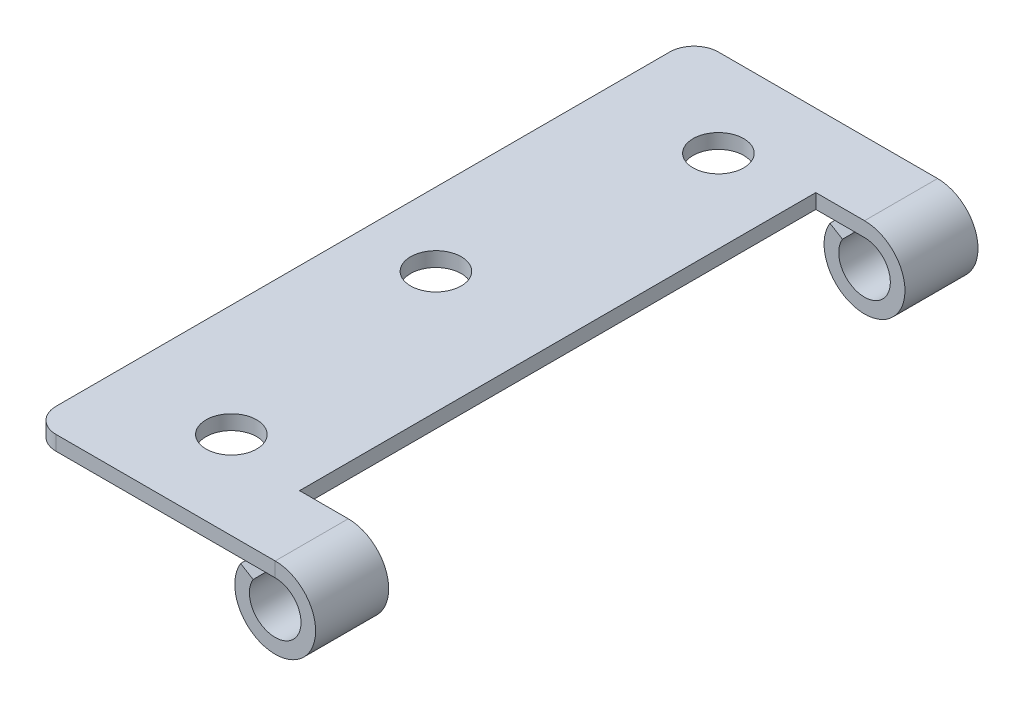
ISO-10303-21;
HEADER;
FILE_DESCRIPTION(('STEP AP214'),'2;1');
FILE_NAME('part.step','',(''),(''),'','','');
FILE_SCHEMA(('AUTOMOTIVE_DESIGN { 1 0 10303 214 1 1 1 1 }'));
ENDSEC;
DATA;
#1=APPLICATION_CONTEXT('core data for automotive mechanical design processes');
#2=APPLICATION_PROTOCOL_DEFINITION('international standard','automotive_design',2000,#1);
#3=PRODUCT_CONTEXT('',#1,'mechanical');
#4=PRODUCT('Part','Part','',(#3));
#5=PRODUCT_RELATED_PRODUCT_CATEGORY('part','',(#4));
#6=PRODUCT_DEFINITION_FORMATION('','',#4);
#7=PRODUCT_DEFINITION_CONTEXT('part definition',#1,'design');
#8=PRODUCT_DEFINITION('design','',#6,#7);
#9=PRODUCT_DEFINITION_SHAPE('','',#8);
#10=(LENGTH_UNIT() NAMED_UNIT(*) SI_UNIT(.MILLI.,.METRE.));
#11=(NAMED_UNIT(*) PLANE_ANGLE_UNIT() SI_UNIT($,.RADIAN.));
#12=(NAMED_UNIT(*) SI_UNIT($,.STERADIAN.) SOLID_ANGLE_UNIT());
#13=UNCERTAINTY_MEASURE_WITH_UNIT(LENGTH_MEASURE(1.E-05),#10,'distance_accuracy_value','');
#14=(GEOMETRIC_REPRESENTATION_CONTEXT(3) GLOBAL_UNCERTAINTY_ASSIGNED_CONTEXT((#13)) GLOBAL_UNIT_ASSIGNED_CONTEXT((#10,
#11,#12)) REPRESENTATION_CONTEXT('',''));
#15=CARTESIAN_POINT('',(0.,0.,0.));
#16=DIRECTION('',(0.,0.,1.));
#17=DIRECTION('',(1.,0.,0.));
#18=AXIS2_PLACEMENT_3D('',#15,#16,#17);
#19=CARTESIAN_POINT('',(12.5,-4.15,34.));
#20=DIRECTION('',(0.,0.,-1.));
#21=DIRECTION('',(-1.,0.,0.));
#22=AXIS2_PLACEMENT_3D('',#19,#20,#21);
#23=CYLINDRICAL_SURFACE('',#22,2.65);
#24=DIRECTION('',(0.,0.,-1.));
#25=VECTOR('',#24,1.);
#26=CARTESIAN_POINT('',(12.5,-1.5,34.));
#27=LINE('',#26,#25);
#28=CARTESIAN_POINT('',(12.5,-1.5,34.));
#29=VERTEX_POINT('',#28);
#30=CARTESIAN_POINT('',(12.5,-1.5,26.5));
#31=VERTEX_POINT('',#30);
#32=EDGE_CURVE('E212',#29,#31,#27,.T.);
#33=ORIENTED_EDGE('',*,*,#32,.T.);
#34=CARTESIAN_POINT('',(12.5,-4.15,26.5));
#35=DIRECTION('',(0.,0.,1.));
#36=DIRECTION('',(1.,0.,0.));
#37=AXIS2_PLACEMENT_3D('',#34,#35,#36);
#38=CIRCLE('',#37,2.65);
#39=CARTESIAN_POINT('',(10.2333573843064,-2.77710843373494,26.5));
#40=VERTEX_POINT('',#39);
#41=EDGE_CURVE('E179',#31,#40,#38,.F.);
#42=ORIENTED_EDGE('',*,*,#41,.T.);
#43=DIRECTION('',(0.,0.,-1.));
#44=VECTOR('',#43,1.);
#45=CARTESIAN_POINT('',(10.2333573843064,-2.77710843373494,34.));
#46=LINE('',#45,#44);
#47=CARTESIAN_POINT('',(10.2333573843064,-2.77710843373494,34.));
#48=VERTEX_POINT('',#47);
#49=EDGE_CURVE('E227',#48,#40,#46,.T.);
#50=ORIENTED_EDGE('',*,*,#49,.F.);
#51=CARTESIAN_POINT('',(12.5,-4.15,34.));
#52=DIRECTION('',(0.,0.,1.));
#53=DIRECTION('',(1.,0.,0.));
#54=AXIS2_PLACEMENT_3D('',#51,#52,#53);
#55=CIRCLE('',#54,2.65);
#56=EDGE_CURVE('E187',#29,#48,#55,.F.);
#57=ORIENTED_EDGE('',*,*,#56,.F.);
#58=EDGE_LOOP('',(#33,#42,#50,#57));
#59=FACE_BOUND('',#58,.T.);
#60=ADVANCED_FACE('F39',(#59),#23,.F.);
#61=CARTESIAN_POINT('',(8.95035213014023,-2.,34.));
#62=DIRECTION('',(0.518072289156626,0.855336836110788,0.));
#63=DIRECTION('',(-0.855336836110788,0.518072289156627,0.));
#64=AXIS2_PLACEMENT_3D('',#61,#62,#63);
#65=PLANE('',#64);
#66=DIRECTION('',(0.855336836110788,-0.518072289156627,0.));
#67=VECTOR('',#66,1.);
#68=CARTESIAN_POINT('',(8.95035213014023,-2.,26.5));
#69=LINE('',#68,#67);
#70=CARTESIAN_POINT('',(8.95035213014023,-2.,26.5));
#71=VERTEX_POINT('',#70);
#72=EDGE_CURVE('E182',#71,#40,#69,.T.);
#73=ORIENTED_EDGE('',*,*,#72,.F.);
#74=DIRECTION('',(0.,0.,-1.));
#75=VECTOR('',#74,1.);
#76=CARTESIAN_POINT('',(8.95035213014023,-2.,34.));
#77=LINE('',#76,#75);
#78=CARTESIAN_POINT('',(8.95035213014023,-2.,34.));
#79=VERTEX_POINT('',#78);
#80=EDGE_CURVE('E223',#79,#71,#77,.T.);
#81=ORIENTED_EDGE('',*,*,#80,.F.);
#82=DIRECTION('',(0.855336836110788,-0.518072289156627,0.));
#83=VECTOR('',#82,1.);
#84=CARTESIAN_POINT('',(8.95035213014023,-2.,34.));
#85=LINE('',#84,#83);
#86=EDGE_CURVE('E189',#79,#48,#85,.T.);
#87=ORIENTED_EDGE('',*,*,#86,.T.);
#88=ORIENTED_EDGE('',*,*,#49,.T.);
#89=EDGE_LOOP('',(#73,#81,#87,#88));
#90=FACE_BOUND('',#89,.T.);
#91=ADVANCED_FACE('F297',(#90),#65,.T.);
#92=CARTESIAN_POINT('',(12.5,-4.15,34.));
#93=DIRECTION('',(0.,0.,-1.));
#94=DIRECTION('',(-1.,0.,0.));
#95=AXIS2_PLACEMENT_3D('',#92,#93,#94);
#96=CYLINDRICAL_SURFACE('',#95,4.15);
#97=ORIENTED_EDGE('',*,*,#80,.T.);
#98=CARTESIAN_POINT('',(12.5,-4.15,26.5));
#99=DIRECTION('',(0.,0.,1.));
#100=DIRECTION('',(1.,0.,0.));
#101=AXIS2_PLACEMENT_3D('',#98,#99,#100);
#102=CIRCLE('',#101,4.15);
#103=CARTESIAN_POINT('',(12.5,0.,26.5));
#104=VERTEX_POINT('',#103);
#105=EDGE_CURVE('E184',#104,#71,#102,.F.);
#106=ORIENTED_EDGE('',*,*,#105,.F.);
#107=DIRECTION('',(0.,0.,-1.));
#108=VECTOR('',#107,1.);
#109=CARTESIAN_POINT('',(12.5,0.,34.));
#110=LINE('',#109,#108);
#111=CARTESIAN_POINT('',(12.5,0.,34.));
#112=VERTEX_POINT('',#111);
#113=EDGE_CURVE('E220',#112,#104,#110,.T.);
#114=ORIENTED_EDGE('',*,*,#113,.F.);
#115=CARTESIAN_POINT('',(12.5,-4.15,34.));
#116=DIRECTION('',(0.,0.,-1.));
#117=DIRECTION('',(-1.,0.,0.));
#118=AXIS2_PLACEMENT_3D('',#115,#116,#117);
#119=CIRCLE('',#118,4.15);
#120=EDGE_CURVE('E193',#112,#79,#119,.T.);
#121=ORIENTED_EDGE('',*,*,#120,.T.);
#122=EDGE_LOOP('',(#97,#106,#114,#121));
#123=FACE_BOUND('',#122,.T.);
#124=ADVANCED_FACE('F290',(#123),#96,.T.);
#125=CARTESIAN_POINT('',(12.5,-1.5,34.));
#126=DIRECTION('',(0.,0.,1.));
#127=DIRECTION('',(1.,0.,0.));
#128=AXIS2_PLACEMENT_3D('',#125,#126,#127);
#129=PLANE('',#128);
#130=DIRECTION('',(0.,1.,0.));
#131=VECTOR('',#130,1.);
#132=CARTESIAN_POINT('',(12.5,-1.5,34.));
#133=LINE('',#132,#131);
#134=EDGE_CURVE('E233',#29,#112,#133,.T.);
#135=ORIENTED_EDGE('',*,*,#134,.F.);
#136=ORIENTED_EDGE('',*,*,#56,.T.);
#137=ORIENTED_EDGE('',*,*,#86,.F.);
#138=ORIENTED_EDGE('',*,*,#120,.F.);
#139=EDGE_LOOP('',(#135,#136,#137,#138));
#140=FACE_BOUND('',#139,.T.);
#141=ADVANCED_FACE('F292',(#140),#129,.T.);
#142=CARTESIAN_POINT('',(12.5,0.,-34.));
#143=DIRECTION('',(0.,0.,-1.));
#144=DIRECTION('',(-1.,0.,0.));
#145=AXIS2_PLACEMENT_3D('',#142,#143,#144);
#146=PLANE('',#145);
#147=DIRECTION('',(0.,-1.,0.));
#148=VECTOR('',#147,1.);
#149=CARTESIAN_POINT('',(12.5,0.,-34.));
#150=LINE('',#149,#148);
#151=CARTESIAN_POINT('',(12.5,0.,-34.));
#152=VERTEX_POINT('',#151);
#153=CARTESIAN_POINT('',(12.5,-1.5,-34.));
#154=VERTEX_POINT('',#153);
#155=EDGE_CURVE('E230',#152,#154,#150,.T.);
#156=ORIENTED_EDGE('',*,*,#155,.F.);
#157=CARTESIAN_POINT('',(12.5,-4.15,-34.));
#158=DIRECTION('',(0.,0.,-1.));
#159=DIRECTION('',(-1.,0.,0.));
#160=AXIS2_PLACEMENT_3D('',#157,#158,#159);
#161=CIRCLE('',#160,4.15);
#162=CARTESIAN_POINT('',(8.95035213014023,-2.,-34.));
#163=VERTEX_POINT('',#162);
#164=EDGE_CURVE('E206',#152,#163,#161,.T.);
#165=ORIENTED_EDGE('',*,*,#164,.T.);
#166=DIRECTION('',(0.855336836110788,-0.518072289156627,0.));
#167=VECTOR('',#166,1.);
#168=CARTESIAN_POINT('',(8.95035213014023,-2.,-34.));
#169=LINE('',#168,#167);
#170=CARTESIAN_POINT('',(10.2333573843064,-2.77710843373494,-34.));
#171=VERTEX_POINT('',#170);
#172=EDGE_CURVE('E203',#163,#171,#169,.T.);
#173=ORIENTED_EDGE('',*,*,#172,.T.);
#174=CARTESIAN_POINT('',(12.5,-4.15,-34.));
#175=DIRECTION('',(0.,0.,1.));
#176=DIRECTION('',(1.,0.,0.));
#177=AXIS2_PLACEMENT_3D('',#174,#175,#176);
#178=CIRCLE('',#177,2.65);
#179=EDGE_CURVE('E186',#154,#171,#178,.F.);
#180=ORIENTED_EDGE('',*,*,#179,.F.);
#181=EDGE_LOOP('',(#156,#165,#173,#180));
#182=FACE_BOUND('',#181,.T.);
#183=ADVANCED_FACE('F313',(#182),#146,.T.);
#184=CARTESIAN_POINT('',(10.2333573843064,-2.77710843373494,-26.5));
#185=VERTEX_POINT('',#184);
#186=EDGE_CURVE('E226',#185,#171,#46,.T.);
#187=ORIENTED_EDGE('',*,*,#186,.F.);
#188=CARTESIAN_POINT('',(12.5,-4.15,-26.5));
#189=DIRECTION('',(0.,0.,-1.));
#190=DIRECTION('',(-1.,0.,0.));
#191=AXIS2_PLACEMENT_3D('',#188,#189,#190);
#192=CIRCLE('',#191,2.65);
#193=CARTESIAN_POINT('',(12.5,-1.5,-26.5));
#194=VERTEX_POINT('',#193);
#195=EDGE_CURVE('E172',#185,#194,#192,.F.);
#196=ORIENTED_EDGE('',*,*,#195,.T.);
#197=EDGE_CURVE('E200',#194,#154,#27,.T.);
#198=ORIENTED_EDGE('',*,*,#197,.T.);
#199=ORIENTED_EDGE('',*,*,#179,.T.);
#200=EDGE_LOOP('',(#187,#196,#198,#199));
#201=FACE_BOUND('',#200,.T.);
#202=ADVANCED_FACE('F304',(#201),#23,.F.);
#203=DIRECTION('',(-0.855336836110788,0.518072289156627,0.));
#204=VECTOR('',#203,1.);
#205=CARTESIAN_POINT('',(8.9503521301402,-1.99999999999998,-26.5));
#206=LINE('',#205,#204);
#207=CARTESIAN_POINT('',(8.95035213014023,-2.,-26.5));
#208=VERTEX_POINT('',#207);
#209=EDGE_CURVE('E176',#185,#208,#206,.T.);
#210=ORIENTED_EDGE('',*,*,#209,.F.);
#211=ORIENTED_EDGE('',*,*,#186,.T.);
#212=ORIENTED_EDGE('',*,*,#172,.F.);
#213=EDGE_CURVE('E222',#208,#163,#77,.T.);
#214=ORIENTED_EDGE('',*,*,#213,.F.);
#215=EDGE_LOOP('',(#210,#211,#212,#214));
#216=FACE_BOUND('',#215,.T.);
#217=ADVANCED_FACE('F307',(#216),#65,.T.);
#218=CARTESIAN_POINT('',(12.5,-4.15,-26.5));
#219=DIRECTION('',(0.,0.,-1.));
#220=DIRECTION('',(-1.,0.,0.));
#221=AXIS2_PLACEMENT_3D('',#218,#219,#220);
#222=CIRCLE('',#221,4.15);
#223=CARTESIAN_POINT('',(12.5,0.,-26.5));
#224=VERTEX_POINT('',#223);
#225=EDGE_CURVE('E159',#208,#224,#222,.F.);
#226=ORIENTED_EDGE('',*,*,#225,.F.);
#227=ORIENTED_EDGE('',*,*,#213,.T.);
#228=ORIENTED_EDGE('',*,*,#164,.F.);
#229=EDGE_CURVE('E219',#224,#152,#110,.T.);
#230=ORIENTED_EDGE('',*,*,#229,.F.);
#231=EDGE_LOOP('',(#226,#227,#228,#230));
#232=FACE_BOUND('',#231,.T.);
#233=ADVANCED_FACE('F311',(#232),#96,.T.);
#234=CARTESIAN_POINT('',(-12.5,0.,34.));
#235=DIRECTION('',(0.,1.,0.));
#236=DIRECTION('',(-1.,0.,0.));
#237=AXIS2_PLACEMENT_3D('',#234,#235,#236);
#238=PLANE('',#237);
#239=CARTESIAN_POINT('',(-0.999999999999995,0.,25.));
#240=DIRECTION('',(0.,1.,0.));
#241=DIRECTION('',(-1.,0.,0.));
#242=AXIS2_PLACEMENT_3D('',#239,#240,#241);
#243=CIRCLE('',#242,2.6);
#244=CARTESIAN_POINT('',(-3.6,0.,25.));
#245=VERTEX_POINT('',#244);
#246=EDGE_CURVE('E250',#245,#245,#243,.T.);
#247=ORIENTED_EDGE('',*,*,#246,.F.);
#248=EDGE_LOOP('',(#247));
#249=FACE_BOUND('',#248,.T.);
#250=CARTESIAN_POINT('',(-5.,0.,0.));
#251=DIRECTION('',(0.,1.,0.));
#252=DIRECTION('',(-1.,0.,0.));
#253=AXIS2_PLACEMENT_3D('',#250,#251,#252);
#254=CIRCLE('',#253,2.6);
#255=CARTESIAN_POINT('',(-7.6,0.,0.));
#256=VERTEX_POINT('',#255);
#257=EDGE_CURVE('E373',#256,#256,#254,.T.);
#258=ORIENTED_EDGE('',*,*,#257,.F.);
#259=EDGE_LOOP('',(#258));
#260=FACE_BOUND('',#259,.T.);
#261=CARTESIAN_POINT('',(-1.,0.,-25.));
#262=DIRECTION('',(0.,1.,0.));
#263=DIRECTION('',(-1.,0.,0.));
#264=AXIS2_PLACEMENT_3D('',#261,#262,#263);
#265=CIRCLE('',#264,2.6);
#266=CARTESIAN_POINT('',(-3.6,0.,-25.));
#267=VERTEX_POINT('',#266);
#268=EDGE_CURVE('E245',#267,#267,#265,.T.);
#269=ORIENTED_EDGE('',*,*,#268,.F.);
#270=EDGE_LOOP('',(#269));
#271=FACE_BOUND('',#270,.T.);
#272=DIRECTION('',(1.,0.,0.));
#273=VECTOR('',#272,1.);
#274=CARTESIAN_POINT('',(-12.5,0.,-34.));
#275=LINE('',#274,#273);
#276=CARTESIAN_POINT('',(-10.,0.,-34.));
#277=VERTEX_POINT('',#276);
#278=EDGE_CURVE('E209',#277,#152,#275,.T.);
#279=ORIENTED_EDGE('',*,*,#278,.F.);
#280=CARTESIAN_POINT('',(-10.,0.,-31.5));
#281=DIRECTION('',(0.,1.,0.));
#282=DIRECTION('',(-1.,0.,0.));
#283=AXIS2_PLACEMENT_3D('',#280,#281,#282);
#284=CIRCLE('',#283,2.5);
#285=CARTESIAN_POINT('',(-12.5,0.,-31.5));
#286=VERTEX_POINT('',#285);
#287=EDGE_CURVE('E257',#277,#286,#284,.T.);
#288=ORIENTED_EDGE('',*,*,#287,.T.);
#289=DIRECTION('',(0.,0.,-1.));
#290=VECTOR('',#289,1.);
#291=CARTESIAN_POINT('',(-12.5,0.,34.));
#292=LINE('',#291,#290);
#293=CARTESIAN_POINT('',(-12.5,0.,31.5));
#294=VERTEX_POINT('',#293);
#295=EDGE_CURVE('E217',#294,#286,#292,.T.);
#296=ORIENTED_EDGE('',*,*,#295,.F.);
#297=CARTESIAN_POINT('',(-10.,0.,31.5));
#298=DIRECTION('',(0.,1.,0.));
#299=DIRECTION('',(-1.,0.,0.));
#300=AXIS2_PLACEMENT_3D('',#297,#298,#299);
#301=CIRCLE('',#300,2.5);
#302=CARTESIAN_POINT('',(-10.,0.,34.));
#303=VERTEX_POINT('',#302);
#304=EDGE_CURVE('E255',#294,#303,#301,.T.);
#305=ORIENTED_EDGE('',*,*,#304,.T.);
#306=DIRECTION('',(1.,0.,0.));
#307=VECTOR('',#306,1.);
#308=CARTESIAN_POINT('',(-12.5,0.,34.));
#309=LINE('',#308,#307);
#310=EDGE_CURVE('E196',#303,#112,#309,.T.);
#311=ORIENTED_EDGE('',*,*,#310,.T.);
#312=ORIENTED_EDGE('',*,*,#113,.T.);
#313=DIRECTION('',(1.,0.,0.));
#314=VECTOR('',#313,1.);
#315=CARTESIAN_POINT('',(16.65,0.,26.5));
#316=LINE('',#315,#314);
#317=CARTESIAN_POINT('',(7.5,0.,26.5));
#318=VERTEX_POINT('',#317);
#319=EDGE_CURVE('E153',#318,#104,#316,.T.);
#320=ORIENTED_EDGE('',*,*,#319,.F.);
#321=DIRECTION('',(0.,0.,1.));
#322=VECTOR('',#321,1.);
#323=CARTESIAN_POINT('',(7.5,0.,-26.5));
#324=LINE('',#323,#322);
#325=CARTESIAN_POINT('',(7.5,0.,-26.5));
#326=VERTEX_POINT('',#325);
#327=EDGE_CURVE('E146',#326,#318,#324,.T.);
#328=ORIENTED_EDGE('',*,*,#327,.F.);
#329=DIRECTION('',(-1.,0.,0.));
#330=VECTOR('',#329,1.);
#331=CARTESIAN_POINT('',(16.65,0.,-26.5));
#332=LINE('',#331,#330);
#333=EDGE_CURVE('E156',#224,#326,#332,.T.);
#334=ORIENTED_EDGE('',*,*,#333,.F.);
#335=ORIENTED_EDGE('',*,*,#229,.T.);
#336=EDGE_LOOP('',(#279,#288,#296,#305,#311,#312,#320,#328,#334,#335));
#337=FACE_BOUND('',#336,.T.);
#338=ADVANCED_FACE('F166',(#249,#260,#271,#337),#238,.T.);
#339=CARTESIAN_POINT('',(-12.5,-1.5,34.));
#340=DIRECTION('',(-1.,0.,0.));
#341=DIRECTION('',(0.,0.,1.));
#342=AXIS2_PLACEMENT_3D('',#339,#340,#341);
#343=PLANE('',#342);
#344=ORIENTED_EDGE('',*,*,#295,.T.);
#345=DIRECTION('',(0.,1.,0.));
#346=VECTOR('',#345,1.);
#347=CARTESIAN_POINT('',(-12.5,-1.5,-31.5));
#348=LINE('',#347,#346);
#349=CARTESIAN_POINT('',(-12.5,-1.5,-31.5));
#350=VERTEX_POINT('',#349);
#351=EDGE_CURVE('E60',#286,#350,#348,.F.);
#352=ORIENTED_EDGE('',*,*,#351,.T.);
#353=DIRECTION('',(0.,0.,-1.));
#354=VECTOR('',#353,1.);
#355=CARTESIAN_POINT('',(-12.5,-1.5,34.));
#356=LINE('',#355,#354);
#357=CARTESIAN_POINT('',(-12.5,-1.5,31.5));
#358=VERTEX_POINT('',#357);
#359=EDGE_CURVE('E215',#358,#350,#356,.T.);
#360=ORIENTED_EDGE('',*,*,#359,.F.);
#361=DIRECTION('',(0.,1.,0.));
#362=VECTOR('',#361,1.);
#363=CARTESIAN_POINT('',(-12.5,-1.5,31.5));
#364=LINE('',#363,#362);
#365=EDGE_CURVE('E259',#358,#294,#364,.T.);
#366=ORIENTED_EDGE('',*,*,#365,.T.);
#367=EDGE_LOOP('',(#344,#352,#360,#366));
#368=FACE_BOUND('',#367,.T.);
#369=ADVANCED_FACE('F278',(#368),#343,.T.);
#370=CARTESIAN_POINT('',(-12.5,-1.5,34.));
#371=DIRECTION('',(0.,1.,0.));
#372=DIRECTION('',(-1.,0.,0.));
#373=AXIS2_PLACEMENT_3D('',#370,#371,#372);
#374=PLANE('',#373);
#375=CARTESIAN_POINT('',(-0.999999999999995,-1.5,25.));
#376=DIRECTION('',(0.,1.,0.));
#377=DIRECTION('',(-1.,0.,0.));
#378=AXIS2_PLACEMENT_3D('',#375,#376,#377);
#379=CIRCLE('',#378,2.6);
#380=CARTESIAN_POINT('',(-3.6,-1.5,25.));
#381=VERTEX_POINT('',#380);
#382=EDGE_CURVE('E249',#381,#381,#379,.T.);
#383=ORIENTED_EDGE('',*,*,#382,.T.);
#384=EDGE_LOOP('',(#383));
#385=FACE_BOUND('',#384,.T.);
#386=CARTESIAN_POINT('',(-5.,-1.5,0.));
#387=DIRECTION('',(0.,1.,0.));
#388=DIRECTION('',(-1.,0.,0.));
#389=AXIS2_PLACEMENT_3D('',#386,#387,#388);
#390=CIRCLE('',#389,2.6);
#391=CARTESIAN_POINT('',(-7.6,-1.5,0.));
#392=VERTEX_POINT('',#391);
#393=EDGE_CURVE('E246',#392,#392,#390,.T.);
#394=ORIENTED_EDGE('',*,*,#393,.T.);
#395=EDGE_LOOP('',(#394));
#396=FACE_BOUND('',#395,.T.);
#397=CARTESIAN_POINT('',(-1.,-1.5,-25.));
#398=DIRECTION('',(0.,1.,0.));
#399=DIRECTION('',(-1.,0.,0.));
#400=AXIS2_PLACEMENT_3D('',#397,#398,#399);
#401=CIRCLE('',#400,2.6);
#402=CARTESIAN_POINT('',(-3.6,-1.5,-25.));
#403=VERTEX_POINT('',#402);
#404=EDGE_CURVE('E163',#403,#403,#401,.T.);
#405=ORIENTED_EDGE('',*,*,#404,.T.);
#406=EDGE_LOOP('',(#405));
#407=FACE_BOUND('',#406,.T.);
#408=ORIENTED_EDGE('',*,*,#359,.T.);
#409=CARTESIAN_POINT('',(-10.,-1.5,-31.5));
#410=DIRECTION('',(0.,1.,0.));
#411=DIRECTION('',(-1.,0.,0.));
#412=AXIS2_PLACEMENT_3D('',#409,#410,#411);
#413=CIRCLE('',#412,2.5);
#414=CARTESIAN_POINT('',(-10.,-1.5,-34.));
#415=VERTEX_POINT('',#414);
#416=EDGE_CURVE('E47',#350,#415,#413,.F.);
#417=ORIENTED_EDGE('',*,*,#416,.T.);
#418=DIRECTION('',(1.,0.,0.));
#419=VECTOR('',#418,1.);
#420=CARTESIAN_POINT('',(-12.5,-1.5,-34.));
#421=LINE('',#420,#419);
#422=EDGE_CURVE('E190',#415,#154,#421,.T.);
#423=ORIENTED_EDGE('',*,*,#422,.T.);
#424=ORIENTED_EDGE('',*,*,#197,.F.);
#425=DIRECTION('',(-1.,0.,0.));
#426=VECTOR('',#425,1.);
#427=CARTESIAN_POINT('',(-12.5,-1.5,-26.5));
#428=LINE('',#427,#426);
#429=CARTESIAN_POINT('',(7.5,-1.5,-26.5));
#430=VERTEX_POINT('',#429);
#431=EDGE_CURVE('E236',#194,#430,#428,.T.);
#432=ORIENTED_EDGE('',*,*,#431,.T.);
#433=DIRECTION('',(0.,0.,1.));
#434=VECTOR('',#433,1.);
#435=CARTESIAN_POINT('',(7.5,-1.5,34.));
#436=LINE('',#435,#434);
#437=CARTESIAN_POINT('',(7.5,-1.5,26.5));
#438=VERTEX_POINT('',#437);
#439=EDGE_CURVE('E149',#430,#438,#436,.T.);
#440=ORIENTED_EDGE('',*,*,#439,.T.);
#441=DIRECTION('',(1.,0.,0.));
#442=VECTOR('',#441,1.);
#443=CARTESIAN_POINT('',(-12.5,-1.5,26.5));
#444=LINE('',#443,#442);
#445=EDGE_CURVE('E239',#438,#31,#444,.T.);
#446=ORIENTED_EDGE('',*,*,#445,.T.);
#447=ORIENTED_EDGE('',*,*,#32,.F.);
#448=DIRECTION('',(1.,0.,0.));
#449=VECTOR('',#448,1.);
#450=CARTESIAN_POINT('',(-12.5,-1.5,34.));
#451=LINE('',#450,#449);
#452=CARTESIAN_POINT('',(-10.,-1.5,34.));
#453=VERTEX_POINT('',#452);
#454=EDGE_CURVE('E198',#453,#29,#451,.T.);
#455=ORIENTED_EDGE('',*,*,#454,.F.);
#456=CARTESIAN_POINT('',(-10.,-1.5,31.5));
#457=DIRECTION('',(0.,1.,0.));
#458=DIRECTION('',(-1.,0.,0.));
#459=AXIS2_PLACEMENT_3D('',#456,#457,#458);
#460=CIRCLE('',#459,2.5);
#461=EDGE_CURVE('E263',#453,#358,#460,.F.);
#462=ORIENTED_EDGE('',*,*,#461,.T.);
#463=EDGE_LOOP('',(#408,#417,#423,#424,#432,#440,#446,#447,#455,#462));
#464=FACE_BOUND('',#463,.T.);
#465=ADVANCED_FACE('F267',(#385,#396,#407,#464),#374,.F.);
#466=CARTESIAN_POINT('',(12.5,-4.15,34.));
#467=DIRECTION('',(0.,0.,1.));
#468=DIRECTION('',(1.,0.,0.));
#469=AXIS2_PLACEMENT_3D('',#466,#467,#468);
#470=PLANE('',#469);
#471=ORIENTED_EDGE('',*,*,#310,.F.);
#472=DIRECTION('',(0.,1.,0.));
#473=VECTOR('',#472,1.);
#474=CARTESIAN_POINT('',(-10.,-4.15,34.));
#475=LINE('',#474,#473);
#476=EDGE_CURVE('E11',#303,#453,#475,.F.);
#477=ORIENTED_EDGE('',*,*,#476,.T.);
#478=ORIENTED_EDGE('',*,*,#454,.T.);
#479=ORIENTED_EDGE('',*,*,#134,.T.);
#480=EDGE_LOOP('',(#471,#477,#478,#479));
#481=FACE_BOUND('',#480,.T.);
#482=ADVANCED_FACE('F282',(#481),#470,.T.);
#483=CARTESIAN_POINT('',(12.5,-4.15,-34.));
#484=DIRECTION('',(0.,0.,1.));
#485=DIRECTION('',(1.,0.,0.));
#486=AXIS2_PLACEMENT_3D('',#483,#484,#485);
#487=PLANE('',#486);
#488=ORIENTED_EDGE('',*,*,#422,.F.);
#489=DIRECTION('',(0.,1.,0.));
#490=VECTOR('',#489,1.);
#491=CARTESIAN_POINT('',(-10.,0.,-34.));
#492=LINE('',#491,#490);
#493=EDGE_CURVE('E242',#415,#277,#492,.T.);
#494=ORIENTED_EDGE('',*,*,#493,.T.);
#495=ORIENTED_EDGE('',*,*,#278,.T.);
#496=ORIENTED_EDGE('',*,*,#155,.T.);
#497=EDGE_LOOP('',(#488,#494,#495,#496));
#498=FACE_BOUND('',#497,.T.);
#499=ADVANCED_FACE('F273',(#498),#487,.F.);
#500=CARTESIAN_POINT('',(7.5,-8.3,-26.5));
#501=DIRECTION('',(-1.,0.,0.));
#502=DIRECTION('',(0.,0.,1.));
#503=AXIS2_PLACEMENT_3D('',#500,#501,#502);
#504=PLANE('',#503);
#505=DIRECTION('',(0.,1.,0.));
#506=VECTOR('',#505,1.);
#507=CARTESIAN_POINT('',(7.5,-8.3,-26.5));
#508=LINE('',#507,#506);
#509=EDGE_CURVE('E141',#430,#326,#508,.T.);
#510=ORIENTED_EDGE('',*,*,#509,.T.);
#511=ORIENTED_EDGE('',*,*,#327,.T.);
#512=DIRECTION('',(0.,1.,0.));
#513=VECTOR('',#512,1.);
#514=CARTESIAN_POINT('',(7.5,-8.3,26.5));
#515=LINE('',#514,#513);
#516=EDGE_CURVE('E152',#438,#318,#515,.T.);
#517=ORIENTED_EDGE('',*,*,#516,.F.);
#518=ORIENTED_EDGE('',*,*,#439,.F.);
#519=EDGE_LOOP('',(#510,#511,#517,#518));
#520=FACE_BOUND('',#519,.T.);
#521=ADVANCED_FACE('F143',(#520),#504,.F.);
#522=CARTESIAN_POINT('',(16.65,-8.3,26.5));
#523=DIRECTION('',(0.,0.,1.));
#524=DIRECTION('',(1.,0.,0.));
#525=AXIS2_PLACEMENT_3D('',#522,#523,#524);
#526=PLANE('',#525);
#527=ORIENTED_EDGE('',*,*,#105,.T.);
#528=ORIENTED_EDGE('',*,*,#72,.T.);
#529=ORIENTED_EDGE('',*,*,#41,.F.);
#530=ORIENTED_EDGE('',*,*,#445,.F.);
#531=ORIENTED_EDGE('',*,*,#516,.T.);
#532=ORIENTED_EDGE('',*,*,#319,.T.);
#533=EDGE_LOOP('',(#527,#528,#529,#530,#531,#532));
#534=FACE_BOUND('',#533,.T.);
#535=ADVANCED_FACE('F299',(#534),#526,.F.);
#536=CARTESIAN_POINT('',(16.65,-8.3,-26.5));
#537=DIRECTION('',(0.,0.,-1.));
#538=DIRECTION('',(-1.,0.,0.));
#539=AXIS2_PLACEMENT_3D('',#536,#537,#538);
#540=PLANE('',#539);
#541=ORIENTED_EDGE('',*,*,#225,.T.);
#542=ORIENTED_EDGE('',*,*,#333,.T.);
#543=ORIENTED_EDGE('',*,*,#509,.F.);
#544=ORIENTED_EDGE('',*,*,#431,.F.);
#545=ORIENTED_EDGE('',*,*,#195,.F.);
#546=ORIENTED_EDGE('',*,*,#209,.T.);
#547=EDGE_LOOP('',(#541,#542,#543,#544,#545,#546));
#548=FACE_BOUND('',#547,.T.);
#549=ADVANCED_FACE('F157',(#548),#540,.F.);
#550=CARTESIAN_POINT('',(-1.,-10.,-25.));
#551=DIRECTION('',(0.,1.,0.));
#552=DIRECTION('',(-1.,0.,0.));
#553=AXIS2_PLACEMENT_3D('',#550,#551,#552);
#554=CYLINDRICAL_SURFACE('',#553,2.6);
#555=ORIENTED_EDGE('',*,*,#268,.T.);
#556=EDGE_LOOP('',(#555));
#557=FACE_BOUND('',#556,.T.);
#558=ORIENTED_EDGE('',*,*,#404,.F.);
#559=EDGE_LOOP('',(#558));
#560=FACE_BOUND('',#559,.T.);
#561=ADVANCED_FACE('F345',(#557,#560),#554,.F.);
#562=CARTESIAN_POINT('',(-5.,-10.,0.));
#563=DIRECTION('',(0.,1.,0.));
#564=DIRECTION('',(-1.,0.,0.));
#565=AXIS2_PLACEMENT_3D('',#562,#563,#564);
#566=CYLINDRICAL_SURFACE('',#565,2.6);
#567=ORIENTED_EDGE('',*,*,#257,.T.);
#568=EDGE_LOOP('',(#567));
#569=FACE_BOUND('',#568,.T.);
#570=ORIENTED_EDGE('',*,*,#393,.F.);
#571=EDGE_LOOP('',(#570));
#572=FACE_BOUND('',#571,.T.);
#573=ADVANCED_FACE('F352',(#569,#572),#566,.F.);
#574=CARTESIAN_POINT('',(-0.999999999999995,-10.,25.));
#575=DIRECTION('',(0.,1.,0.));
#576=DIRECTION('',(-1.,0.,0.));
#577=AXIS2_PLACEMENT_3D('',#574,#575,#576);
#578=CYLINDRICAL_SURFACE('',#577,2.6);
#579=ORIENTED_EDGE('',*,*,#246,.T.);
#580=EDGE_LOOP('',(#579));
#581=FACE_BOUND('',#580,.T.);
#582=ORIENTED_EDGE('',*,*,#382,.F.);
#583=EDGE_LOOP('',(#582));
#584=FACE_BOUND('',#583,.T.);
#585=ADVANCED_FACE('F356',(#581,#584),#578,.F.);
#586=CARTESIAN_POINT('',(-10.,-4.15,-31.5));
#587=DIRECTION('',(0.,-1.,0.));
#588=DIRECTION('',(0.,0.,-1.));
#589=AXIS2_PLACEMENT_3D('',#586,#587,#588);
#590=CYLINDRICAL_SURFACE('',#589,2.5);
#591=ORIENTED_EDGE('',*,*,#416,.F.);
#592=ORIENTED_EDGE('',*,*,#351,.F.);
#593=ORIENTED_EDGE('',*,*,#287,.F.);
#594=ORIENTED_EDGE('',*,*,#493,.F.);
#595=EDGE_LOOP('',(#591,#592,#593,#594));
#596=FACE_BOUND('',#595,.T.);
#597=ADVANCED_FACE('F276',(#596),#590,.T.);
#598=CARTESIAN_POINT('',(-10.,-1.5,31.5));
#599=DIRECTION('',(0.,1.,0.));
#600=DIRECTION('',(0.,0.,1.));
#601=AXIS2_PLACEMENT_3D('',#598,#599,#600);
#602=CYLINDRICAL_SURFACE('',#601,2.5);
#603=ORIENTED_EDGE('',*,*,#461,.F.);
#604=ORIENTED_EDGE('',*,*,#476,.F.);
#605=ORIENTED_EDGE('',*,*,#304,.F.);
#606=ORIENTED_EDGE('',*,*,#365,.F.);
#607=EDGE_LOOP('',(#603,#604,#605,#606));
#608=FACE_BOUND('',#607,.T.);
#609=ADVANCED_FACE('F41',(#608),#602,.T.);
#610=CLOSED_SHELL('',(#60,#91,#124,#141,#183,#202,#217,#233,#338,#369,#465,#482,#499,#521,#535,
#549,#561,#573,#585,#597,#609));
#611=MANIFOLD_SOLID_BREP('B2',#610);
#612=ADVANCED_BREP_SHAPE_REPRESENTATION('',(#18,#611),#14);
#613=SHAPE_DEFINITION_REPRESENTATION(#9,#612);
ENDSEC;
END-ISO-10303-21;
